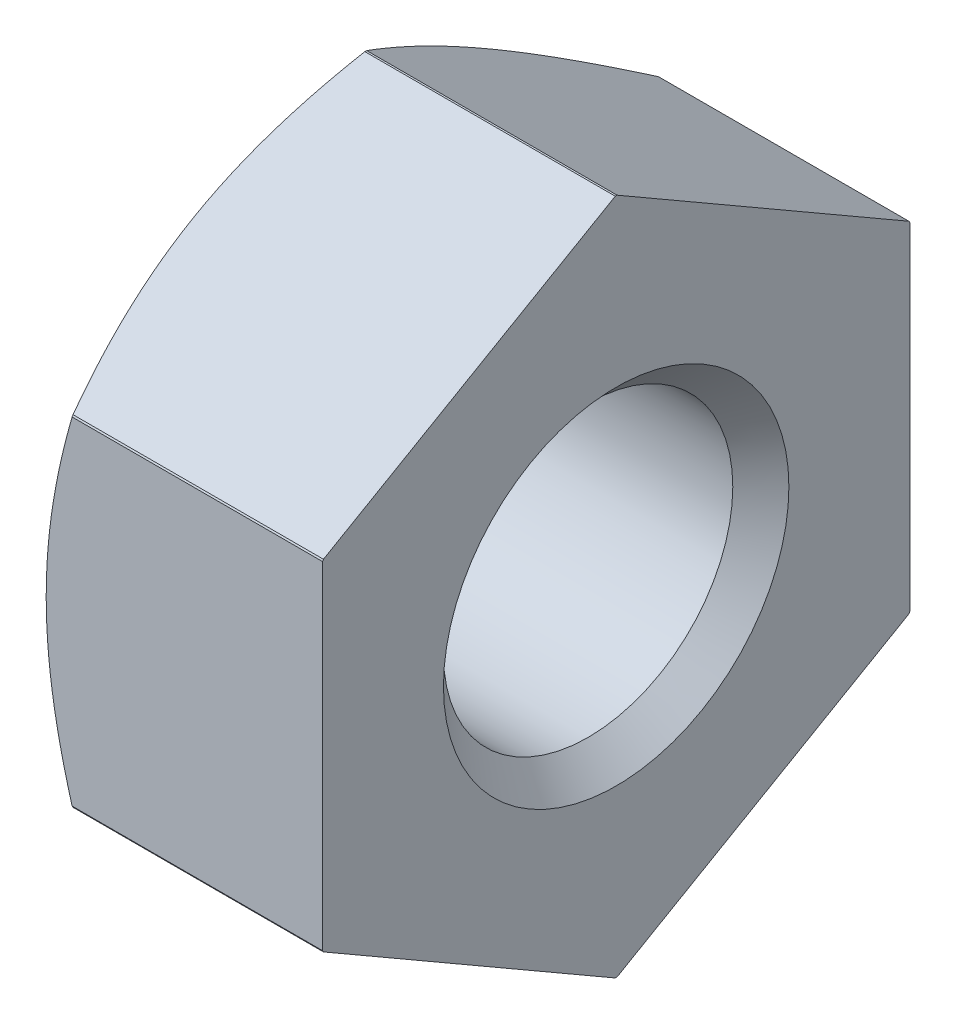
ISO-10303-21;
HEADER;
FILE_DESCRIPTION(('STEP AP214'),'2;1');
FILE_NAME('part.step','',(''),(''),'','','');
FILE_SCHEMA(('AUTOMOTIVE_DESIGN { 1 0 10303 214 1 1 1 1 }'));
ENDSEC;
DATA;
#1=APPLICATION_CONTEXT('core data for automotive mechanical design processes');
#2=APPLICATION_PROTOCOL_DEFINITION('international standard','automotive_design',2000,#1);
#3=PRODUCT_CONTEXT('',#1,'mechanical');
#4=PRODUCT('Part','Part','',(#3));
#5=PRODUCT_RELATED_PRODUCT_CATEGORY('part','',(#4));
#6=PRODUCT_DEFINITION_FORMATION('','',#4);
#7=PRODUCT_DEFINITION_CONTEXT('part definition',#1,'design');
#8=PRODUCT_DEFINITION('design','',#6,#7);
#9=PRODUCT_DEFINITION_SHAPE('','',#8);
#10=(LENGTH_UNIT() NAMED_UNIT(*) SI_UNIT(.MILLI.,.METRE.));
#11=(NAMED_UNIT(*) PLANE_ANGLE_UNIT() SI_UNIT($,.RADIAN.));
#12=(NAMED_UNIT(*) SI_UNIT($,.STERADIAN.) SOLID_ANGLE_UNIT());
#13=UNCERTAINTY_MEASURE_WITH_UNIT(LENGTH_MEASURE(1.E-05),#10,'distance_accuracy_value','');
#14=(GEOMETRIC_REPRESENTATION_CONTEXT(3) GLOBAL_UNCERTAINTY_ASSIGNED_CONTEXT((#13)) GLOBAL_UNIT_ASSIGNED_CONTEXT((#10,
#11,#12)) REPRESENTATION_CONTEXT('',''));
#15=CARTESIAN_POINT('',(0.,0.,0.));
#16=DIRECTION('',(0.,0.,1.));
#17=DIRECTION('',(1.,0.,0.));
#18=AXIS2_PLACEMENT_3D('',#15,#16,#17);
#19=CARTESIAN_POINT('',(-4.,0.,0.));
#20=DIRECTION('',(1.,0.,0.));
#21=DIRECTION('',(0.,0.,-1.));
#22=AXIS2_PLACEMENT_3D('',#19,#20,#21);
#23=CONICAL_SURFACE('',#22,8.5,1.0471975511966);
#24=CARTESIAN_POINT('',(-3.24944465005349,0.,0.));
#25=DIRECTION('',(1.,0.,0.));
#26=DIRECTION('',(0.,0.,-1.));
#27=AXIS2_PLACEMENT_3D('',#24,#25,#26);
#28=CIRCLE('',#27,9.8);
#29=CARTESIAN_POINT('',(-3.24944465005349,-4.87749935930288,8.5));
#30=VERTEX_POINT('',#29);
#31=CARTESIAN_POINT('',(-3.24944465005349,-4.92246625251629,8.47403835209862));
#32=VERTEX_POINT('',#31);
#33=EDGE_CURVE('E256',#30,#32,#28,.T.);
#34=ORIENTED_EDGE('',*,*,#33,.F.);
#35=CARTESIAN_POINT('',(0.0668981299534289,-13.0141554636911,8.5));
#36=CARTESIAN_POINT('',(-0.113442310388662,-12.6409667144146,8.5));
#37=CARTESIAN_POINT('',(-0.291989651447961,-12.2668954971279,8.5));
#38=CARTESIAN_POINT('',(-0.644473465651217,-11.5165109474706,8.5));
#39=CARTESIAN_POINT('',(-0.818409140192501,-11.140197240409,8.5));
#40=CARTESIAN_POINT('',(-1.16156151599734,-10.3828171245547,8.5));
#41=CARTESIAN_POINT('',(-1.33074550513281,-10.0017358407823,8.5));
#42=CARTESIAN_POINT('',(-1.66184490370266,-9.23644074986565,8.5));
#43=CARTESIAN_POINT('',(-1.82376069211653,-8.85222710728662,8.5));
#44=CARTESIAN_POINT('',(-2.14031085365934,-8.07529173605248,8.5));
#45=CARTESIAN_POINT('',(-2.29483159331959,-7.6825234506156,8.5));
#46=CARTESIAN_POINT('',(-2.59176816653962,-6.89235475761759,8.5));
#47=CARTESIAN_POINT('',(-2.73418265319496,-6.49495384022252,8.5));
#48=CARTESIAN_POINT('',(-3.00307864597913,-5.6956993531533,8.5));
#49=CARTESIAN_POINT('',(-3.12959403599491,-5.29385730896312,8.5));
#50=CARTESIAN_POINT('',(-3.36258433707791,-4.48447500626761,8.5));
#51=CARTESIAN_POINT('',(-3.46906558688123,-4.07693659406466,8.5));
#52=CARTESIAN_POINT('',(-3.65680982275367,-3.25581460215141,8.5));
#53=CARTESIAN_POINT('',(-3.73806603038348,-2.84222942877259,8.5));
#54=CARTESIAN_POINT('',(-3.83696229574864,-2.21821329300162,8.5));
#55=CARTESIAN_POINT('',(-3.86609852241379,-2.00957591157551,8.5));
#56=CARTESIAN_POINT('',(-3.91613499152818,-1.59132338556575,8.5));
#57=CARTESIAN_POINT('',(-3.93703604928941,-1.38170833985462,8.5));
#58=CARTESIAN_POINT('',(-3.97003976469108,-0.963112848401275,8.5));
#59=CARTESIAN_POINT('',(-3.98219702712797,-0.754136725343992,8.5));
#60=CARTESIAN_POINT('',(-3.99764889484739,-0.335857184152331,8.5));
#61=CARTESIAN_POINT('',(-4.00094361509251,-0.126553770298723,8.5));
#62=CARTESIAN_POINT('',(-3.99859189748252,0.291944795044443,8.5));
#63=CARTESIAN_POINT('',(-3.99294796746044,0.501139960433449,8.5));
#64=CARTESIAN_POINT('',(-3.97285926445266,0.919110099356398,8.5));
#65=CARTESIAN_POINT('',(-3.95841405241086,1.12788505140647,8.5));
#66=CARTESIAN_POINT('',(-3.9130350931748,1.63392972703721,8.5));
#67=CARTESIAN_POINT('',(-3.87768944039689,1.93081029496677,8.5));
#68=CARTESIAN_POINT('',(-3.79116321590253,2.522295651168,8.5));
#69=CARTESIAN_POINT('',(-3.73997832116343,2.81689979560571,8.5));
#70=CARTESIAN_POINT('',(-3.62358899019288,3.40358953269197,8.5));
#71=CARTESIAN_POINT('',(-3.55837129542616,3.69567246989472,8.5));
#72=CARTESIAN_POINT('',(-3.41590616426768,4.27683284711462,8.5));
#73=CARTESIAN_POINT('',(-3.33865986127828,4.56591056756514,8.5));
#74=CARTESIAN_POINT('',(-3.17196673684967,5.14817877546839,8.5));
#75=CARTESIAN_POINT('',(-3.08226732209645,5.44129644981587,8.5));
#76=CARTESIAN_POINT('',(-2.89400822472744,6.02443351215706,8.5));
#77=CARTESIAN_POINT('',(-2.7954546543519,6.31445488519922,8.5));
#78=CARTESIAN_POINT('',(-2.59152275241051,6.89023557148366,8.5));
#79=CARTESIAN_POINT('',(-2.48618596203989,7.17600968658385,8.5));
#80=CARTESIAN_POINT('',(-2.26933135861378,7.74534092315303,8.5));
#81=CARTESIAN_POINT('',(-2.15781104638987,8.02889709458918,8.5));
#82=CARTESIAN_POINT('',(-2.04381071590478,8.31142325015981,8.5));
#83=B_SPLINE_CURVE_WITH_KNOTS('',3,(#35,#36,#37,#38,#39,#40,#41,#42,#43,#44,#45,#46,#47,#48,#49,
#50,#51,#52,#53,#54,#55,#56,#57,#58,#59,#60,#61,#62,#63,#64,#65,#66,#67,#68,#69,#70,#71,#72,#73,
#74,#75,#76,#77,#78,#79,#80,#81,#82),.UNSPECIFIED.,.F.,.F.,(4,2,2,2,2,2,2,2,2,2,2,2,2,2,2,2,2,2,
2,2,2,2,2,4),(0.,1.24345250890554,2.48711895850738,3.73790450070649,4.98862474834106,
6.25468173223564,7.52087938988067,8.78433105753031,10.0473822984999,11.3107726516887,
11.9426216042895,12.5744079857953,13.2022137845353,13.8300114395016,14.4576329903842,
15.0852858530276,15.9817179880804,16.878395003506,17.7759229710586,18.6733664196513,
19.5928023204115,20.5116083187852,21.4252421403207,22.3392479518879),.UNSPECIFIED.);
#84=CARTESIAN_POINT('',(-4.,0.,8.5));
#85=VERTEX_POINT('',#84);
#86=EDGE_CURVE('E158',#30,#85,#83,.T.);
#87=ORIENTED_EDGE('',*,*,#86,.T.);
#88=CARTESIAN_POINT('',(-4.,0.,0.));
#89=DIRECTION('',(1.,0.,0.));
#90=DIRECTION('',(0.,0.,-1.));
#91=AXIS2_PLACEMENT_3D('',#88,#89,#90);
#92=CIRCLE('',#91,8.5);
#93=CARTESIAN_POINT('',(-4.,-7.36121593216773,4.25));
#94=VERTEX_POINT('',#93);
#95=EDGE_CURVE('E151',#85,#94,#92,.T.);
#96=ORIENTED_EDGE('',*,*,#95,.T.);
#97=CARTESIAN_POINT('',(-3.2493099425084,-9.8002,0.0255556756634835));
#98=CARTESIAN_POINT('',(-3.31122767769186,-9.69244770105462,0.212188132069232));
#99=CARTESIAN_POINT('',(-3.37031046087961,-9.58429380190873,0.399516180426607));
#100=CARTESIAN_POINT('',(-3.48202334162938,-9.3671202916754,0.775671734208811));
#101=CARTESIAN_POINT('',(-3.53465131839745,-9.25810040852026,0.964499710868733));
#102=CARTESIAN_POINT('',(-3.68182439318358,-8.9292967690605,1.53400432012659));
#103=CARTESIAN_POINT('',(-3.76539294083316,-8.7082193730539,1.91692160241504));
#104=CARTESIAN_POINT('',(-3.86313166470218,-8.37738256929008,2.48994775554768));
#105=CARTESIAN_POINT('',(-3.89092412492029,-8.26860158082001,2.67836195447541));
#106=CARTESIAN_POINT('',(-3.93740341637209,-8.05055807942421,3.05602437715314));
#107=CARTESIAN_POINT('',(-3.95609132158573,-7.94129562482762,3.24527249987412));
#108=CARTESIAN_POINT('',(-3.98388947869823,-7.72258742038387,3.62408622200286));
#109=CARTESIAN_POINT('',(-3.99301031739226,-7.61314200766273,3.81365123749122));
#110=CARTESIAN_POINT('',(-4.00147923075827,-7.39415829271911,4.19294215780376));
#111=CARTESIAN_POINT('',(-4.00082761926561,-7.28461999359257,4.38266805726559));
#112=CARTESIAN_POINT('',(-3.99053440181878,-7.08080248351122,4.73569034019868));
#113=CARTESIAN_POINT('',(-3.98214787252691,-6.98650691558371,4.89901505477769));
#114=CARTESIAN_POINT('',(-3.95829779220943,-6.79813782818214,5.22527988473258));
#115=CARTESIAN_POINT('',(-3.94283377748631,-6.70406432366305,5.38821997420571));
#116=CARTESIAN_POINT('',(-3.88618348292191,-6.42221043339833,5.87640523245515));
#117=CARTESIAN_POINT('',(-3.83474611613563,-6.23492627611135,6.20079090832892));
#118=CARTESIAN_POINT('',(-3.70647957598132,-5.85840923096794,6.85293756043302));
#119=CARTESIAN_POINT('',(-3.62912070518855,-5.66922302728265,7.18061767730701));
#120=CARTESIAN_POINT('',(-3.45367445182676,-5.29362980976313,7.83116421302909));
#121=CARTESIAN_POINT('',(-3.35562679282497,-5.10721819253908,8.15403860518223));
#122=CARTESIAN_POINT('',(-3.24924465005349,-4.92211826298935,8.47464108763979));
#123=B_SPLINE_CURVE_WITH_KNOTS('',3,(#97,#98,#99,#100,#101,#102,#103,#104,#105,#106,#107,#108,
#109,#110,#111,#112,#113,#114,#115,#116,#117,#118,#119,#120,#121,#122),.UNSPECIFIED.,.F.,.F.,(4,
2,2,2,2,2,2,2,2,2,2,2,4),(0.,0.672615550048199,1.34545150627667,2.69393607341207,
3.35177258310566,4.0095314751244,4.66656172908549,5.32357088302733,5.88976602920824,
6.45599827625882,7.58923878134302,8.74721335905947,9.9029844730281),.UNSPECIFIED.);
#124=EDGE_CURVE('E124',#94,#32,#123,.T.);
#125=ORIENTED_EDGE('',*,*,#124,.T.);
#126=EDGE_LOOP('',(#34,#87,#96,#125));
#127=FACE_BOUND('',#126,.T.);
#128=ADVANCED_FACE('F16',(#127),#23,.T.);
#129=CARTESIAN_POINT('',(-4.,7.36121593216773,4.25));
#130=VERTEX_POINT('',#129);
#131=EDGE_CURVE('E159',#130,#85,#92,.T.);
#132=ORIENTED_EDGE('',*,*,#131,.T.);
#133=CARTESIAN_POINT('',(-3.24944465005349,4.87749935930288,8.5));
#134=VERTEX_POINT('',#133);
#135=EDGE_CURVE('E211',#85,#134,#83,.T.);
#136=ORIENTED_EDGE('',*,*,#135,.T.);
#137=CARTESIAN_POINT('',(-3.24944465005349,4.92246625251629,8.47403835209862));
#138=VERTEX_POINT('',#137);
#139=EDGE_CURVE('E254',#138,#134,#28,.T.);
#140=ORIENTED_EDGE('',*,*,#139,.F.);
#141=CARTESIAN_POINT('',(-3.24924465005349,4.92211826298935,8.47464108763979));
#142=CARTESIAN_POINT('',(-3.31116507978131,5.02987147671753,8.28800704678374));
#143=CARTESIAN_POINT('',(-3.37025062519961,5.13802629520254,8.10067740608431));
#144=CARTESIAN_POINT('',(-3.48196915539594,5.3552016637214,7.72451863365715));
#145=CARTESIAN_POINT('',(-3.53460001940489,5.46422248583123,7.53568903068));
#146=CARTESIAN_POINT('',(-3.68178196168683,5.79302904482076,6.96617936464823));
#147=CARTESIAN_POINT('',(-3.76535665194112,6.01410846599894,6.58325857465971));
#148=CARTESIAN_POINT('',(-3.86310457280958,6.34494840281132,6.01022699492779));
#149=CARTESIAN_POINT('',(-3.89090005453214,6.45373041446838,5.82181102378822));
#150=CARTESIAN_POINT('',(-3.93738535264423,6.67177602201768,5.4441449531456));
#151=CARTESIAN_POINT('',(-3.95607624303737,6.78103955957264,5.2548949546857));
#152=CARTESIAN_POINT('',(-3.98388025805249,6.99974998557874,4.8760773846981));
#153=CARTESIAN_POINT('',(-3.99300397029018,7.10919653680967,4.68651039725294));
#154=CARTESIAN_POINT('',(-4.00147844742036,7.32818259161777,4.30721542417626));
#155=CARTESIAN_POINT('',(-4.00082952621292,7.43772209209636,4.11748744391162));
#156=CARTESIAN_POINT('',(-3.99054119587758,7.64153965160966,3.76446507535989));
#157=CARTESIAN_POINT('',(-3.98215706771208,7.73583406278115,3.60114236434108));
#158=CARTESIAN_POINT('',(-3.95831189910312,7.92420088337275,3.27488146061621));
#159=CARTESIAN_POINT('',(-3.94285039500108,8.01827327784201,3.1119432938058));
#160=CARTESIAN_POINT('',(-3.88620772904319,8.30012390075744,2.62376369477134));
#161=CARTESIAN_POINT('',(-3.83477557342275,8.48740596966737,2.29938163607271));
#162=CARTESIAN_POINT('',(-3.70651950751486,8.8639188813258,1.64724214337463));
#163=CARTESIAN_POINT('',(-3.62916590508343,9.05310304362587,1.31956556228354));
#164=CARTESIAN_POINT('',(-3.45372993082809,9.42869229301309,0.669025899568227));
#165=CARTESIAN_POINT('',(-3.35568728059761,9.61510198303983,0.346154845418748));
#166=CARTESIAN_POINT('',(-3.2493099425084,9.8002,0.0255556756634846));
#167=B_SPLINE_CURVE_WITH_KNOTS('',3,(#141,#142,#143,#144,#145,#146,#147,#148,#149,#150,#151,
#152,#153,#154,#155,#156,#157,#158,#159,#160,#161,#162,#163,#164,#165,#166),.UNSPECIFIED.,.F.,
.F.,(4,2,2,2,2,2,2,2,2,2,2,2,4),(0.,0.672623058893938,1.34546652806546,2.6939664917931,
3.35181023997752,4.00957636822934,4.6666138021519,5.32363013186966,5.88981802827564,
6.45604302253549,7.58926898511512,8.74722837832148,9.90298447134047),.UNSPECIFIED.);
#168=EDGE_CURVE('E236',#138,#130,#167,.T.);
#169=ORIENTED_EDGE('',*,*,#168,.T.);
#170=EDGE_LOOP('',(#132,#136,#140,#169));
#171=FACE_BOUND('',#170,.T.);
#172=ADVANCED_FACE('F338',(#171),#23,.T.);
#173=CARTESIAN_POINT('',(-4.,0.,-8.5));
#174=VERTEX_POINT('',#173);
#175=CARTESIAN_POINT('',(-4.,7.36121593216773,-4.25));
#176=VERTEX_POINT('',#175);
#177=EDGE_CURVE('E165',#174,#176,#92,.T.);
#178=ORIENTED_EDGE('',*,*,#177,.T.);
#179=CARTESIAN_POINT('',(-3.2493099425084,9.8002,-0.0255556756634835));
#180=CARTESIAN_POINT('',(-3.31122767769186,9.69244770105462,-0.212188132069232));
#181=CARTESIAN_POINT('',(-3.37031046087961,9.58429380190873,-0.399516180426607));
#182=CARTESIAN_POINT('',(-3.48202334162938,9.3671202916754,-0.775671734208811));
#183=CARTESIAN_POINT('',(-3.53465131839745,9.25810040852026,-0.964499710868733));
#184=CARTESIAN_POINT('',(-3.68182439318358,8.9292967690605,-1.53400432012659));
#185=CARTESIAN_POINT('',(-3.76539294083316,8.7082193730539,-1.91692160241504));
#186=CARTESIAN_POINT('',(-3.86313166470218,8.37738256929008,-2.48994775554768));
#187=CARTESIAN_POINT('',(-3.89092412492029,8.26860158082001,-2.67836195447541));
#188=CARTESIAN_POINT('',(-3.93740341637209,8.05055807942421,-3.05602437715314));
#189=CARTESIAN_POINT('',(-3.95609132158573,7.94129562482762,-3.24527249987412));
#190=CARTESIAN_POINT('',(-3.98388947869823,7.72258742038387,-3.62408622200286));
#191=CARTESIAN_POINT('',(-3.99301031739226,7.61314200766273,-3.81365123749122));
#192=CARTESIAN_POINT('',(-4.00147923075827,7.39415829271911,-4.19294215780376));
#193=CARTESIAN_POINT('',(-4.00082761926561,7.28461999359257,-4.38266805726559));
#194=CARTESIAN_POINT('',(-3.99053440181878,7.08080248351122,-4.73569034019868));
#195=CARTESIAN_POINT('',(-3.98214787252691,6.98650691558371,-4.89901505477769));
#196=CARTESIAN_POINT('',(-3.95829779220943,6.79813782818214,-5.22527988473258));
#197=CARTESIAN_POINT('',(-3.94283377748631,6.70406432366305,-5.38821997420571));
#198=CARTESIAN_POINT('',(-3.88618348292191,6.42221043339833,-5.87640523245515));
#199=CARTESIAN_POINT('',(-3.83474611613563,6.23492627611135,-6.20079090832892));
#200=CARTESIAN_POINT('',(-3.70647957598132,5.85840923096794,-6.85293756043302));
#201=CARTESIAN_POINT('',(-3.62912070518855,5.66922302728265,-7.18061767730701));
#202=CARTESIAN_POINT('',(-3.45367445182676,5.29362980976313,-7.83116421302909));
#203=CARTESIAN_POINT('',(-3.35562679282497,5.10721819253908,-8.15403860518223));
#204=CARTESIAN_POINT('',(-3.24924465005349,4.92211826298935,-8.47464108763979));
#205=B_SPLINE_CURVE_WITH_KNOTS('',3,(#179,#180,#181,#182,#183,#184,#185,#186,#187,#188,#189,
#190,#191,#192,#193,#194,#195,#196,#197,#198,#199,#200,#201,#202,#203,#204),.UNSPECIFIED.,.F.,
.F.,(4,2,2,2,2,2,2,2,2,2,2,2,4),(0.,0.672615550048199,1.34545150627667,2.69393607341207,
3.35177258310566,4.0095314751244,4.66656172908549,5.32357088302733,5.88976602920824,
6.45599827625882,7.58923878134302,8.74721335905947,9.9029844730281),.UNSPECIFIED.);
#206=CARTESIAN_POINT('',(-3.24944465005349,4.92246625251629,-8.47403835209862));
#207=VERTEX_POINT('',#206);
#208=EDGE_CURVE('E286',#176,#207,#205,.T.);
#209=ORIENTED_EDGE('',*,*,#208,.T.);
#210=CARTESIAN_POINT('',(-3.24944465005349,4.87749935930288,-8.5));
#211=VERTEX_POINT('',#210);
#212=EDGE_CURVE('E193',#211,#207,#28,.T.);
#213=ORIENTED_EDGE('',*,*,#212,.F.);
#214=CARTESIAN_POINT('',(0.0668981299534289,-13.0141554636911,-8.5));
#215=CARTESIAN_POINT('',(-0.113442310388662,-12.6409667144146,-8.5));
#216=CARTESIAN_POINT('',(-0.291989651447961,-12.2668954971279,-8.5));
#217=CARTESIAN_POINT('',(-0.644473465651217,-11.5165109474706,-8.5));
#218=CARTESIAN_POINT('',(-0.818409140192501,-11.140197240409,-8.5));
#219=CARTESIAN_POINT('',(-1.16156151599734,-10.3828171245547,-8.5));
#220=CARTESIAN_POINT('',(-1.33074550513281,-10.0017358407823,-8.5));
#221=CARTESIAN_POINT('',(-1.66184490370266,-9.23644074986565,-8.5));
#222=CARTESIAN_POINT('',(-1.82376069211653,-8.85222710728662,-8.5));
#223=CARTESIAN_POINT('',(-2.14031085365934,-8.07529173605248,-8.5));
#224=CARTESIAN_POINT('',(-2.29483159331959,-7.6825234506156,-8.5));
#225=CARTESIAN_POINT('',(-2.59176816653962,-6.89235475761759,-8.5));
#226=CARTESIAN_POINT('',(-2.73418265319496,-6.49495384022252,-8.5));
#227=CARTESIAN_POINT('',(-3.00307864597913,-5.6956993531533,-8.5));
#228=CARTESIAN_POINT('',(-3.12959403599491,-5.29385730896312,-8.5));
#229=CARTESIAN_POINT('',(-3.36258433707791,-4.48447500626761,-8.5));
#230=CARTESIAN_POINT('',(-3.46906558688123,-4.07693659406466,-8.5));
#231=CARTESIAN_POINT('',(-3.65680982275367,-3.25581460215141,-8.5));
#232=CARTESIAN_POINT('',(-3.73806603038348,-2.84222942877259,-8.5));
#233=CARTESIAN_POINT('',(-3.83696229574864,-2.21821329300162,-8.5));
#234=CARTESIAN_POINT('',(-3.86609852241379,-2.00957591157551,-8.5));
#235=CARTESIAN_POINT('',(-3.91613499152818,-1.59132338556575,-8.5));
#236=CARTESIAN_POINT('',(-3.93703604928941,-1.38170833985462,-8.5));
#237=CARTESIAN_POINT('',(-3.97003976469108,-0.963112848401275,-8.5));
#238=CARTESIAN_POINT('',(-3.98219702712797,-0.754136725343992,-8.5));
#239=CARTESIAN_POINT('',(-3.99764889484739,-0.335857184152331,-8.5));
#240=CARTESIAN_POINT('',(-4.00094361509251,-0.126553770298723,-8.5));
#241=CARTESIAN_POINT('',(-3.99859189748252,0.291944795044443,-8.5));
#242=CARTESIAN_POINT('',(-3.99294796746044,0.501139960433449,-8.5));
#243=CARTESIAN_POINT('',(-3.97285926445266,0.919110099356398,-8.5));
#244=CARTESIAN_POINT('',(-3.95841405241086,1.12788505140647,-8.5));
#245=CARTESIAN_POINT('',(-3.9130350931748,1.63392972703721,-8.5));
#246=CARTESIAN_POINT('',(-3.87768944039689,1.93081029496677,-8.5));
#247=CARTESIAN_POINT('',(-3.79116321590253,2.522295651168,-8.5));
#248=CARTESIAN_POINT('',(-3.73997832116343,2.81689979560571,-8.5));
#249=CARTESIAN_POINT('',(-3.62358899019288,3.40358953269197,-8.5));
#250=CARTESIAN_POINT('',(-3.55837129542616,3.69567246989472,-8.5));
#251=CARTESIAN_POINT('',(-3.41590616426768,4.27683284711462,-8.5));
#252=CARTESIAN_POINT('',(-3.33865986127828,4.56591056756514,-8.5));
#253=CARTESIAN_POINT('',(-3.17196673684967,5.14817877546839,-8.5));
#254=CARTESIAN_POINT('',(-3.08226732209645,5.44129644981587,-8.5));
#255=CARTESIAN_POINT('',(-2.89400822472744,6.02443351215706,-8.5));
#256=CARTESIAN_POINT('',(-2.7954546543519,6.31445488519922,-8.5));
#257=CARTESIAN_POINT('',(-2.59152275241051,6.89023557148366,-8.5));
#258=CARTESIAN_POINT('',(-2.48618596203989,7.17600968658385,-8.5));
#259=CARTESIAN_POINT('',(-2.26933135861378,7.74534092315303,-8.5));
#260=CARTESIAN_POINT('',(-2.15781104638987,8.02889709458918,-8.5));
#261=CARTESIAN_POINT('',(-2.04381071590478,8.31142325015981,-8.5));
#262=B_SPLINE_CURVE_WITH_KNOTS('',3,(#214,#215,#216,#217,#218,#219,#220,#221,#222,#223,#224,
#225,#226,#227,#228,#229,#230,#231,#232,#233,#234,#235,#236,#237,#238,#239,#240,#241,#242,#243,
#244,#245,#246,#247,#248,#249,#250,#251,#252,#253,#254,#255,#256,#257,#258,#259,#260,#261),
.UNSPECIFIED.,.F.,.F.,(4,2,2,2,2,2,2,2,2,2,2,2,2,2,2,2,2,2,2,2,2,2,2,4),(0.,1.24345250890554,
2.48711895850738,3.73790450070649,4.98862474834106,6.25468173223564,7.52087938988067,
8.78433105753031,10.0473822984999,11.3107726516887,11.9426216042895,12.5744079857953,
13.2022137845353,13.8300114395016,14.4576329903842,15.0852858530276,15.9817179880804,
16.878395003506,17.7759229710586,18.6733664196513,19.5928023204115,20.5116083187852,
21.4252421403207,22.3392479518879),.UNSPECIFIED.);
#263=EDGE_CURVE('E298',#211,#174,#262,.F.);
#264=ORIENTED_EDGE('',*,*,#263,.T.);
#265=EDGE_LOOP('',(#178,#209,#213,#264));
#266=FACE_BOUND('',#265,.T.);
#267=ADVANCED_FACE('F332',(#266),#23,.T.);
#268=CARTESIAN_POINT('',(-4.,-7.36121593216773,-4.25));
#269=VERTEX_POINT('',#268);
#270=EDGE_CURVE('E155',#269,#174,#92,.T.);
#271=ORIENTED_EDGE('',*,*,#270,.T.);
#272=CARTESIAN_POINT('',(-3.24944465005349,-4.87749935930288,-8.5));
#273=VERTEX_POINT('',#272);
#274=EDGE_CURVE('E297',#174,#273,#262,.F.);
#275=ORIENTED_EDGE('',*,*,#274,.T.);
#276=CARTESIAN_POINT('',(-3.24944465005349,-4.92246625251629,-8.47403835209862));
#277=VERTEX_POINT('',#276);
#278=EDGE_CURVE('E258',#277,#273,#28,.T.);
#279=ORIENTED_EDGE('',*,*,#278,.F.);
#280=CARTESIAN_POINT('',(-3.24924465005349,-4.92211826298935,-8.47464108763979));
#281=CARTESIAN_POINT('',(-3.31116507978131,-5.02987147671753,-8.28800704678374));
#282=CARTESIAN_POINT('',(-3.37025062519961,-5.13802629520254,-8.10067740608431));
#283=CARTESIAN_POINT('',(-3.48196915539594,-5.3552016637214,-7.72451863365715));
#284=CARTESIAN_POINT('',(-3.53460001940489,-5.46422248583123,-7.53568903068));
#285=CARTESIAN_POINT('',(-3.68178196168683,-5.79302904482076,-6.96617936464823));
#286=CARTESIAN_POINT('',(-3.76535665194112,-6.01410846599894,-6.58325857465971));
#287=CARTESIAN_POINT('',(-3.86310457280958,-6.34494840281132,-6.01022699492779));
#288=CARTESIAN_POINT('',(-3.89090005453214,-6.45373041446838,-5.82181102378822));
#289=CARTESIAN_POINT('',(-3.93738535264423,-6.67177602201768,-5.4441449531456));
#290=CARTESIAN_POINT('',(-3.95607624303737,-6.78103955957264,-5.2548949546857));
#291=CARTESIAN_POINT('',(-3.98388025805249,-6.99974998557874,-4.8760773846981));
#292=CARTESIAN_POINT('',(-3.99300397029018,-7.10919653680967,-4.68651039725294));
#293=CARTESIAN_POINT('',(-4.00147844742036,-7.32818259161777,-4.30721542417626));
#294=CARTESIAN_POINT('',(-4.00082952621292,-7.43772209209636,-4.11748744391162));
#295=CARTESIAN_POINT('',(-3.99054119587758,-7.64153965160966,-3.76446507535989));
#296=CARTESIAN_POINT('',(-3.98215706771208,-7.73583406278115,-3.60114236434108));
#297=CARTESIAN_POINT('',(-3.95831189910312,-7.92420088337275,-3.27488146061621));
#298=CARTESIAN_POINT('',(-3.94285039500108,-8.01827327784201,-3.1119432938058));
#299=CARTESIAN_POINT('',(-3.88620772904319,-8.30012390075744,-2.62376369477134));
#300=CARTESIAN_POINT('',(-3.83477557342275,-8.48740596966737,-2.29938163607271));
#301=CARTESIAN_POINT('',(-3.70651950751486,-8.8639188813258,-1.64724214337463));
#302=CARTESIAN_POINT('',(-3.62916590508343,-9.05310304362587,-1.31956556228354));
#303=CARTESIAN_POINT('',(-3.45372993082809,-9.42869229301309,-0.669025899568227));
#304=CARTESIAN_POINT('',(-3.35568728059761,-9.61510198303983,-0.346154845418748));
#305=CARTESIAN_POINT('',(-3.2493099425084,-9.8002,-0.0255556756634846));
#306=B_SPLINE_CURVE_WITH_KNOTS('',3,(#280,#281,#282,#283,#284,#285,#286,#287,#288,#289,#290,
#291,#292,#293,#294,#295,#296,#297,#298,#299,#300,#301,#302,#303,#304,#305),.UNSPECIFIED.,.F.,
.F.,(4,2,2,2,2,2,2,2,2,2,2,2,4),(0.,0.672623058893938,1.34546652806546,2.6939664917931,
3.35181023997752,4.00957636822934,4.6666138021519,5.32363013186966,5.88981802827564,
6.45604302253549,7.58926898511512,8.74722837832148,9.90298447134047),.UNSPECIFIED.);
#307=EDGE_CURVE('E318',#277,#269,#306,.T.);
#308=ORIENTED_EDGE('',*,*,#307,.T.);
#309=EDGE_LOOP('',(#271,#275,#279,#308));
#310=FACE_BOUND('',#309,.T.);
#311=ADVANCED_FACE('F329',(#310),#23,.T.);
#312=EDGE_CURVE('E142',#94,#269,#92,.T.);
#313=ORIENTED_EDGE('',*,*,#312,.T.);
#314=CARTESIAN_POINT('',(-3.24944465005349,-9.79996561181917,-0.0259616479013788));
#315=VERTEX_POINT('',#314);
#316=EDGE_CURVE('E325',#269,#315,#306,.T.);
#317=ORIENTED_EDGE('',*,*,#316,.T.);
#318=CARTESIAN_POINT('',(-3.24944465005349,-9.79996561181917,0.0259616479013807));
#319=VERTEX_POINT('',#318);
#320=EDGE_CURVE('E144',#319,#315,#28,.T.);
#321=ORIENTED_EDGE('',*,*,#320,.F.);
#322=EDGE_CURVE('E127',#319,#94,#123,.T.);
#323=ORIENTED_EDGE('',*,*,#322,.T.);
#324=EDGE_LOOP('',(#313,#317,#321,#323));
#325=FACE_BOUND('',#324,.T.);
#326=ADVANCED_FACE('F140',(#325),#23,.T.);
#327=CARTESIAN_POINT('',(4.,0.,0.));
#328=DIRECTION('',(1.,0.,0.));
#329=DIRECTION('',(0.,0.,-1.));
#330=AXIS2_PLACEMENT_3D('',#327,#328,#329);
#331=CYLINDRICAL_SURFACE('',#330,9.8);
#332=ORIENTED_EDGE('',*,*,#139,.T.);
#333=DIRECTION('',(1.,0.,0.));
#334=VECTOR('',#333,1.);
#335=CARTESIAN_POINT('',(4.,4.87749935930288,8.5));
#336=LINE('',#335,#334);
#337=CARTESIAN_POINT('',(4.,4.87749935930288,8.5));
#338=VERTEX_POINT('',#337);
#339=EDGE_CURVE('E191',#134,#338,#336,.T.);
#340=ORIENTED_EDGE('',*,*,#339,.T.);
#341=CARTESIAN_POINT('',(4.,0.,0.));
#342=DIRECTION('',(1.,0.,0.));
#343=DIRECTION('',(0.,0.,-1.));
#344=AXIS2_PLACEMENT_3D('',#341,#342,#343);
#345=CIRCLE('',#344,9.8);
#346=CARTESIAN_POINT('',(4.,4.92246625251629,8.47403835209862));
#347=VERTEX_POINT('',#346);
#348=EDGE_CURVE('E182',#347,#338,#345,.T.);
#349=ORIENTED_EDGE('',*,*,#348,.F.);
#350=DIRECTION('',(1.,0.,0.));
#351=VECTOR('',#350,1.);
#352=CARTESIAN_POINT('',(4.,4.92246625251629,8.47403835209862));
#353=LINE('',#352,#351);
#354=EDGE_CURVE('E189',#347,#138,#353,.F.);
#355=ORIENTED_EDGE('',*,*,#354,.T.);
#356=EDGE_LOOP('',(#332,#340,#349,#355));
#357=FACE_BOUND('',#356,.T.);
#358=ADVANCED_FACE('F188',(#357),#331,.T.);
#359=ORIENTED_EDGE('',*,*,#212,.T.);
#360=DIRECTION('',(1.,0.,0.));
#361=VECTOR('',#360,1.);
#362=CARTESIAN_POINT('',(4.,4.92246625251629,-8.47403835209862));
#363=LINE('',#362,#361);
#364=CARTESIAN_POINT('',(4.,4.92246625251629,-8.47403835209862));
#365=VERTEX_POINT('',#364);
#366=EDGE_CURVE('E282',#207,#365,#363,.T.);
#367=ORIENTED_EDGE('',*,*,#366,.T.);
#368=CARTESIAN_POINT('',(4.,4.87749935930288,-8.5));
#369=VERTEX_POINT('',#368);
#370=EDGE_CURVE('E194',#369,#365,#345,.T.);
#371=ORIENTED_EDGE('',*,*,#370,.F.);
#372=DIRECTION('',(1.,0.,0.));
#373=VECTOR('',#372,1.);
#374=CARTESIAN_POINT('',(4.,4.87749935930288,-8.5));
#375=LINE('',#374,#373);
#376=EDGE_CURVE('E39',#369,#211,#375,.F.);
#377=ORIENTED_EDGE('',*,*,#376,.T.);
#378=EDGE_LOOP('',(#359,#367,#371,#377));
#379=FACE_BOUND('',#378,.T.);
#380=ADVANCED_FACE('F281',(#379),#331,.T.);
#381=ORIENTED_EDGE('',*,*,#278,.T.);
#382=DIRECTION('',(1.,0.,0.));
#383=VECTOR('',#382,1.);
#384=CARTESIAN_POINT('',(4.,-4.87749935930288,-8.5));
#385=LINE('',#384,#383);
#386=CARTESIAN_POINT('',(4.,-4.87749935930288,-8.5));
#387=VERTEX_POINT('',#386);
#388=EDGE_CURVE('E295',#273,#387,#385,.T.);
#389=ORIENTED_EDGE('',*,*,#388,.T.);
#390=CARTESIAN_POINT('',(4.,-4.92246625251629,-8.47403835209862));
#391=VERTEX_POINT('',#390);
#392=EDGE_CURVE('E276',#391,#387,#345,.T.);
#393=ORIENTED_EDGE('',*,*,#392,.F.);
#394=DIRECTION('',(1.,0.,0.));
#395=VECTOR('',#394,1.);
#396=CARTESIAN_POINT('',(4.,-4.92246625251629,-8.47403835209862));
#397=LINE('',#396,#395);
#398=EDGE_CURVE('E326',#391,#277,#397,.F.);
#399=ORIENTED_EDGE('',*,*,#398,.T.);
#400=EDGE_LOOP('',(#381,#389,#393,#399));
#401=FACE_BOUND('',#400,.T.);
#402=ADVANCED_FACE('F397',(#401),#331,.T.);
#403=ORIENTED_EDGE('',*,*,#320,.T.);
#404=DIRECTION('',(1.,0.,0.));
#405=VECTOR('',#404,1.);
#406=CARTESIAN_POINT('',(4.,-9.79996561181917,-0.0259616479013807));
#407=LINE('',#406,#405);
#408=CARTESIAN_POINT('',(4.,-9.79996561181917,-0.0259616479013813));
#409=VERTEX_POINT('',#408);
#410=EDGE_CURVE('E275',#315,#409,#407,.T.);
#411=ORIENTED_EDGE('',*,*,#410,.T.);
#412=CARTESIAN_POINT('',(4.,-9.79996561181917,0.0259616479013815));
#413=VERTEX_POINT('',#412);
#414=EDGE_CURVE('E196',#413,#409,#345,.T.);
#415=ORIENTED_EDGE('',*,*,#414,.F.);
#416=DIRECTION('',(1.,0.,0.));
#417=VECTOR('',#416,1.);
#418=CARTESIAN_POINT('',(4.,-9.79996561181917,0.0259616479013807));
#419=LINE('',#418,#417);
#420=EDGE_CURVE('E145',#413,#319,#419,.F.);
#421=ORIENTED_EDGE('',*,*,#420,.T.);
#422=EDGE_LOOP('',(#403,#411,#415,#421));
#423=FACE_BOUND('',#422,.T.);
#424=ADVANCED_FACE('F274',(#423),#331,.T.);
#425=CARTESIAN_POINT('',(4.,-4.87749935930288,8.5));
#426=VERTEX_POINT('',#425);
#427=CARTESIAN_POINT('',(4.,-4.92246625251629,8.47403835209862));
#428=VERTEX_POINT('',#427);
#429=EDGE_CURVE('E192',#426,#428,#345,.T.);
#430=ORIENTED_EDGE('',*,*,#429,.F.);
#431=DIRECTION('',(1.,0.,0.));
#432=VECTOR('',#431,1.);
#433=CARTESIAN_POINT('',(4.,-4.87749935930288,8.5));
#434=LINE('',#433,#432);
#435=EDGE_CURVE('E218',#426,#30,#434,.F.);
#436=ORIENTED_EDGE('',*,*,#435,.T.);
#437=ORIENTED_EDGE('',*,*,#33,.T.);
#438=DIRECTION('',(1.,0.,0.));
#439=VECTOR('',#438,1.);
#440=CARTESIAN_POINT('',(4.,-4.92246625251629,8.47403835209862));
#441=LINE('',#440,#439);
#442=EDGE_CURVE('E130',#32,#428,#441,.T.);
#443=ORIENTED_EDGE('',*,*,#442,.T.);
#444=EDGE_LOOP('',(#430,#436,#437,#443));
#445=FACE_BOUND('',#444,.T.);
#446=ADVANCED_FACE('F271',(#445),#331,.T.);
#447=CARTESIAN_POINT('',(-4.,0.,0.));
#448=DIRECTION('',(1.,0.,0.));
#449=DIRECTION('',(0.,0.,-1.));
#450=AXIS2_PLACEMENT_3D('',#447,#448,#449);
#451=PLANE('',#450);
#452=EDGE_CURVE('E160',#176,#130,#92,.T.);
#453=ORIENTED_EDGE('',*,*,#452,.F.);
#454=ORIENTED_EDGE('',*,*,#177,.F.);
#455=ORIENTED_EDGE('',*,*,#270,.F.);
#456=ORIENTED_EDGE('',*,*,#312,.F.);
#457=ORIENTED_EDGE('',*,*,#95,.F.);
#458=ORIENTED_EDGE('',*,*,#131,.F.);
#459=EDGE_LOOP('',(#453,#454,#455,#456,#457,#458));
#460=FACE_BOUND('',#459,.T.);
#461=CARTESIAN_POINT('',(-4.,0.,0.));
#462=DIRECTION('',(1.,0.,0.));
#463=DIRECTION('',(0.,0.,-1.));
#464=AXIS2_PLACEMENT_3D('',#461,#462,#463);
#465=CIRCLE('',#464,5.);
#466=CARTESIAN_POINT('',(-4.,0.,-5.));
#467=VERTEX_POINT('',#466);
#468=EDGE_CURVE('E198',#467,#467,#465,.T.);
#469=ORIENTED_EDGE('',*,*,#468,.T.);
#470=EDGE_LOOP('',(#469));
#471=FACE_BOUND('',#470,.T.);
#472=ADVANCED_FACE('F18',(#460,#471),#451,.F.);
#473=ORIENTED_EDGE('',*,*,#452,.T.);
#474=CARTESIAN_POINT('',(-3.24944465005349,9.79996561181917,0.0259616479013788));
#475=VERTEX_POINT('',#474);
#476=EDGE_CURVE('E243',#130,#475,#167,.T.);
#477=ORIENTED_EDGE('',*,*,#476,.T.);
#478=CARTESIAN_POINT('',(-3.24944465005349,9.79996561181917,-0.0259616479013807));
#479=VERTEX_POINT('',#478);
#480=EDGE_CURVE('E166',#479,#475,#28,.T.);
#481=ORIENTED_EDGE('',*,*,#480,.F.);
#482=EDGE_CURVE('E287',#479,#176,#205,.T.);
#483=ORIENTED_EDGE('',*,*,#482,.T.);
#484=EDGE_LOOP('',(#473,#477,#481,#483));
#485=FACE_BOUND('',#484,.T.);
#486=ADVANCED_FACE('F220',(#485),#23,.T.);
#487=CARTESIAN_POINT('',(4.,9.79996561181917,-0.0259616479013781));
#488=VERTEX_POINT('',#487);
#489=CARTESIAN_POINT('',(4.,9.79996561181917,0.0259616479013787));
#490=VERTEX_POINT('',#489);
#491=EDGE_CURVE('E31',#488,#490,#345,.T.);
#492=ORIENTED_EDGE('',*,*,#491,.F.);
#493=DIRECTION('',(1.,0.,0.));
#494=VECTOR('',#493,1.);
#495=CARTESIAN_POINT('',(4.,9.79996561181917,-0.0259616479013807));
#496=LINE('',#495,#494);
#497=EDGE_CURVE('E253',#488,#479,#496,.F.);
#498=ORIENTED_EDGE('',*,*,#497,.T.);
#499=ORIENTED_EDGE('',*,*,#480,.T.);
#500=DIRECTION('',(1.,0.,0.));
#501=VECTOR('',#500,1.);
#502=CARTESIAN_POINT('',(4.,9.79996561181917,0.0259616479013807));
#503=LINE('',#502,#501);
#504=EDGE_CURVE('E245',#475,#490,#503,.T.);
#505=ORIENTED_EDGE('',*,*,#504,.T.);
#506=EDGE_LOOP('',(#492,#498,#499,#505));
#507=FACE_BOUND('',#506,.T.);
#508=ADVANCED_FACE('F252',(#507),#331,.T.);
#509=CARTESIAN_POINT('',(4.,9.8,0.));
#510=DIRECTION('',(-1.,0.,0.));
#511=DIRECTION('',(0.,0.,1.));
#512=AXIS2_PLACEMENT_3D('',#509,#510,#511);
#513=PLANE('',#512);
#514=CARTESIAN_POINT('',(4.,0.,0.));
#515=DIRECTION('',(1.,0.,0.));
#516=DIRECTION('',(0.,0.,-1.));
#517=AXIS2_PLACEMENT_3D('',#514,#515,#516);
#518=CIRCLE('',#517,5.);
#519=CARTESIAN_POINT('',(4.,0.,-5.));
#520=VERTEX_POINT('',#519);
#521=EDGE_CURVE('E207',#520,#520,#518,.T.);
#522=ORIENTED_EDGE('',*,*,#521,.F.);
#523=EDGE_LOOP('',(#522));
#524=FACE_BOUND('',#523,.T.);
#525=ORIENTED_EDGE('',*,*,#348,.T.);
#526=DIRECTION('',(0.,-1.,0.));
#527=VECTOR('',#526,1.);
#528=CARTESIAN_POINT('',(4.,9.8,8.5));
#529=LINE('',#528,#527);
#530=EDGE_CURVE('E10',#338,#426,#529,.T.);
#531=ORIENTED_EDGE('',*,*,#530,.T.);
#532=ORIENTED_EDGE('',*,*,#429,.T.);
#533=DIRECTION('',(0.,-0.5,-0.866025403784439));
#534=VECTOR('',#533,1.);
#535=CARTESIAN_POINT('',(4.,-4.91121593216773,8.49352447854375));
#536=LINE('',#535,#534);
#537=EDGE_CURVE('E164',#428,#413,#536,.T.);
#538=ORIENTED_EDGE('',*,*,#537,.T.);
#539=ORIENTED_EDGE('',*,*,#414,.T.);
#540=DIRECTION('',(0.,0.5,-0.866025403784439));
#541=VECTOR('',#540,1.);
#542=CARTESIAN_POINT('',(4.,-4.91121593216773,-8.49352447854375));
#543=LINE('',#542,#541);
#544=EDGE_CURVE('E170',#409,#391,#543,.T.);
#545=ORIENTED_EDGE('',*,*,#544,.T.);
#546=ORIENTED_EDGE('',*,*,#392,.T.);
#547=DIRECTION('',(0.,1.,0.));
#548=VECTOR('',#547,1.);
#549=CARTESIAN_POINT('',(4.,9.8,-8.5));
#550=LINE('',#549,#548);
#551=EDGE_CURVE('E173',#387,#369,#550,.T.);
#552=ORIENTED_EDGE('',*,*,#551,.T.);
#553=ORIENTED_EDGE('',*,*,#370,.T.);
#554=DIRECTION('',(0.,0.5,0.866025403784439));
#555=VECTOR('',#554,1.);
#556=CARTESIAN_POINT('',(4.,9.81121593216773,-0.00647552145624942));
#557=LINE('',#556,#555);
#558=EDGE_CURVE('E175',#365,#488,#557,.T.);
#559=ORIENTED_EDGE('',*,*,#558,.T.);
#560=ORIENTED_EDGE('',*,*,#491,.T.);
#561=DIRECTION('',(0.,-0.5,0.866025403784439));
#562=VECTOR('',#561,1.);
#563=CARTESIAN_POINT('',(4.,9.81121593216773,0.00647552145624969));
#564=LINE('',#563,#562);
#565=EDGE_CURVE('E24',#490,#347,#564,.T.);
#566=ORIENTED_EDGE('',*,*,#565,.T.);
#567=EDGE_LOOP('',(#525,#531,#532,#538,#539,#545,#546,#552,#553,#559,#560,#566));
#568=FACE_BOUND('',#567,.T.);
#569=ADVANCED_FACE('F181',(#524,#568),#513,.F.);
#570=CARTESIAN_POINT('',(-4.,0.,0.));
#571=DIRECTION('',(-1.,0.,0.));
#572=DIRECTION('',(0.,0.,1.));
#573=AXIS2_PLACEMENT_3D('',#570,#571,#572);
#574=CONICAL_SURFACE('',#573,5.,0.785398163397448);
#575=CARTESIAN_POINT('',(-3.188,0.,0.));
#576=DIRECTION('',(1.,0.,0.));
#577=DIRECTION('',(0.,0.,-1.));
#578=AXIS2_PLACEMENT_3D('',#575,#576,#577);
#579=CIRCLE('',#578,4.188);
#580=CARTESIAN_POINT('',(-3.188,0.,-4.188));
#581=VERTEX_POINT('',#580);
#582=EDGE_CURVE('E201',#581,#581,#579,.T.);
#583=ORIENTED_EDGE('',*,*,#582,.T.);
#584=EDGE_LOOP('',(#583));
#585=FACE_BOUND('',#584,.T.);
#586=ORIENTED_EDGE('',*,*,#468,.F.);
#587=EDGE_LOOP('',(#586));
#588=FACE_BOUND('',#587,.T.);
#589=ADVANCED_FACE('F436',(#585,#588),#574,.F.);
#590=CARTESIAN_POINT('',(4.,0.,0.));
#591=DIRECTION('',(1.,0.,0.));
#592=DIRECTION('',(0.,0.,-1.));
#593=AXIS2_PLACEMENT_3D('',#590,#591,#592);
#594=CYLINDRICAL_SURFACE('',#593,4.188);
#595=CARTESIAN_POINT('',(3.188,0.,0.));
#596=DIRECTION('',(1.,0.,0.));
#597=DIRECTION('',(0.,0.,-1.));
#598=AXIS2_PLACEMENT_3D('',#595,#596,#597);
#599=CIRCLE('',#598,4.188);
#600=CARTESIAN_POINT('',(3.188,0.,-4.188));
#601=VERTEX_POINT('',#600);
#602=EDGE_CURVE('E204',#601,#601,#599,.T.);
#603=ORIENTED_EDGE('',*,*,#602,.T.);
#604=EDGE_LOOP('',(#603));
#605=FACE_BOUND('',#604,.T.);
#606=ORIENTED_EDGE('',*,*,#582,.F.);
#607=EDGE_LOOP('',(#606));
#608=FACE_BOUND('',#607,.T.);
#609=ADVANCED_FACE('F445',(#605,#608),#594,.F.);
#610=CARTESIAN_POINT('',(3.188,0.,0.));
#611=DIRECTION('',(1.,0.,0.));
#612=DIRECTION('',(0.,0.,-1.));
#613=AXIS2_PLACEMENT_3D('',#610,#611,#612);
#614=CONICAL_SURFACE('',#613,4.188,0.785398163397448);
#615=ORIENTED_EDGE('',*,*,#521,.T.);
#616=EDGE_LOOP('',(#615));
#617=FACE_BOUND('',#616,.T.);
#618=ORIENTED_EDGE('',*,*,#602,.F.);
#619=EDGE_LOOP('',(#618));
#620=FACE_BOUND('',#619,.T.);
#621=ADVANCED_FACE('F454',(#617,#620),#614,.F.);
#622=CARTESIAN_POINT('',(4.,-4.90747728811182,8.5));
#623=DIRECTION('',(0.,0.866025403784439,-0.5));
#624=DIRECTION('',(0.,0.5,0.866025403784439));
#625=AXIS2_PLACEMENT_3D('',#622,#623,#624);
#626=PLANE('',#625);
#627=ORIENTED_EDGE('',*,*,#124,.F.);
#628=ORIENTED_EDGE('',*,*,#322,.F.);
#629=ORIENTED_EDGE('',*,*,#420,.F.);
#630=ORIENTED_EDGE('',*,*,#537,.F.);
#631=ORIENTED_EDGE('',*,*,#442,.F.);
#632=EDGE_LOOP('',(#627,#628,#629,#630,#631));
#633=FACE_BOUND('',#632,.T.);
#634=ADVANCED_FACE('F126',(#633),#626,.F.);
#635=CARTESIAN_POINT('',(4.,-9.81495457622364,0.));
#636=DIRECTION('',(0.,0.866025403784439,0.5));
#637=DIRECTION('',(0.,-0.5,0.866025403784439));
#638=AXIS2_PLACEMENT_3D('',#635,#636,#637);
#639=PLANE('',#638);
#640=ORIENTED_EDGE('',*,*,#316,.F.);
#641=ORIENTED_EDGE('',*,*,#307,.F.);
#642=ORIENTED_EDGE('',*,*,#398,.F.);
#643=ORIENTED_EDGE('',*,*,#544,.F.);
#644=ORIENTED_EDGE('',*,*,#410,.F.);
#645=EDGE_LOOP('',(#640,#641,#642,#643,#644));
#646=FACE_BOUND('',#645,.T.);
#647=ADVANCED_FACE('F310',(#646),#639,.F.);
#648=CARTESIAN_POINT('',(4.,-4.90747728811182,-8.5));
#649=DIRECTION('',(0.,0.,1.));
#650=DIRECTION('',(1.,0.,0.));
#651=AXIS2_PLACEMENT_3D('',#648,#649,#650);
#652=PLANE('',#651);
#653=ORIENTED_EDGE('',*,*,#274,.F.);
#654=ORIENTED_EDGE('',*,*,#263,.F.);
#655=ORIENTED_EDGE('',*,*,#376,.F.);
#656=ORIENTED_EDGE('',*,*,#551,.F.);
#657=ORIENTED_EDGE('',*,*,#388,.F.);
#658=EDGE_LOOP('',(#653,#654,#655,#656,#657));
#659=FACE_BOUND('',#658,.T.);
#660=ADVANCED_FACE('F306',(#659),#652,.F.);
#661=CARTESIAN_POINT('',(4.,4.90747728811182,-8.5));
#662=DIRECTION('',(0.,-0.866025403784439,0.5));
#663=DIRECTION('',(0.,-0.5,-0.866025403784439));
#664=AXIS2_PLACEMENT_3D('',#661,#662,#663);
#665=PLANE('',#664);
#666=ORIENTED_EDGE('',*,*,#208,.F.);
#667=ORIENTED_EDGE('',*,*,#482,.F.);
#668=ORIENTED_EDGE('',*,*,#497,.F.);
#669=ORIENTED_EDGE('',*,*,#558,.F.);
#670=ORIENTED_EDGE('',*,*,#366,.F.);
#671=EDGE_LOOP('',(#666,#667,#668,#669,#670));
#672=FACE_BOUND('',#671,.T.);
#673=ADVANCED_FACE('F232',(#672),#665,.F.);
#674=CARTESIAN_POINT('',(4.,9.81495457622364,0.));
#675=DIRECTION('',(0.,-0.866025403784439,-0.5));
#676=DIRECTION('',(0.,0.5,-0.866025403784439));
#677=AXIS2_PLACEMENT_3D('',#674,#675,#676);
#678=PLANE('',#677);
#679=ORIENTED_EDGE('',*,*,#476,.F.);
#680=ORIENTED_EDGE('',*,*,#168,.F.);
#681=ORIENTED_EDGE('',*,*,#354,.F.);
#682=ORIENTED_EDGE('',*,*,#565,.F.);
#683=ORIENTED_EDGE('',*,*,#504,.F.);
#684=EDGE_LOOP('',(#679,#680,#681,#682,#683));
#685=FACE_BOUND('',#684,.T.);
#686=ADVANCED_FACE('F227',(#685),#678,.F.);
#687=CARTESIAN_POINT('',(4.,4.90747728811182,8.5));
#688=DIRECTION('',(0.,0.,-1.));
#689=DIRECTION('',(-1.,0.,0.));
#690=AXIS2_PLACEMENT_3D('',#687,#688,#689);
#691=PLANE('',#690);
#692=ORIENTED_EDGE('',*,*,#135,.F.);
#693=ORIENTED_EDGE('',*,*,#86,.F.);
#694=ORIENTED_EDGE('',*,*,#435,.F.);
#695=ORIENTED_EDGE('',*,*,#530,.F.);
#696=ORIENTED_EDGE('',*,*,#339,.F.);
#697=EDGE_LOOP('',(#692,#693,#694,#695,#696));
#698=FACE_BOUND('',#697,.T.);
#699=ADVANCED_FACE('F223',(#698),#691,.F.);
#700=CLOSED_SHELL('',(#128,#172,#267,#311,#326,#358,#380,#402,#424,#446,#472,#486,#508,#569,
#589,#609,#621,#634,#647,#660,#673,#686,#699));
#701=MANIFOLD_SOLID_BREP('B1',#700);
#702=ADVANCED_BREP_SHAPE_REPRESENTATION('',(#18,#701),#14);
#703=SHAPE_DEFINITION_REPRESENTATION(#9,#702);
ENDSEC;
END-ISO-10303-21;
